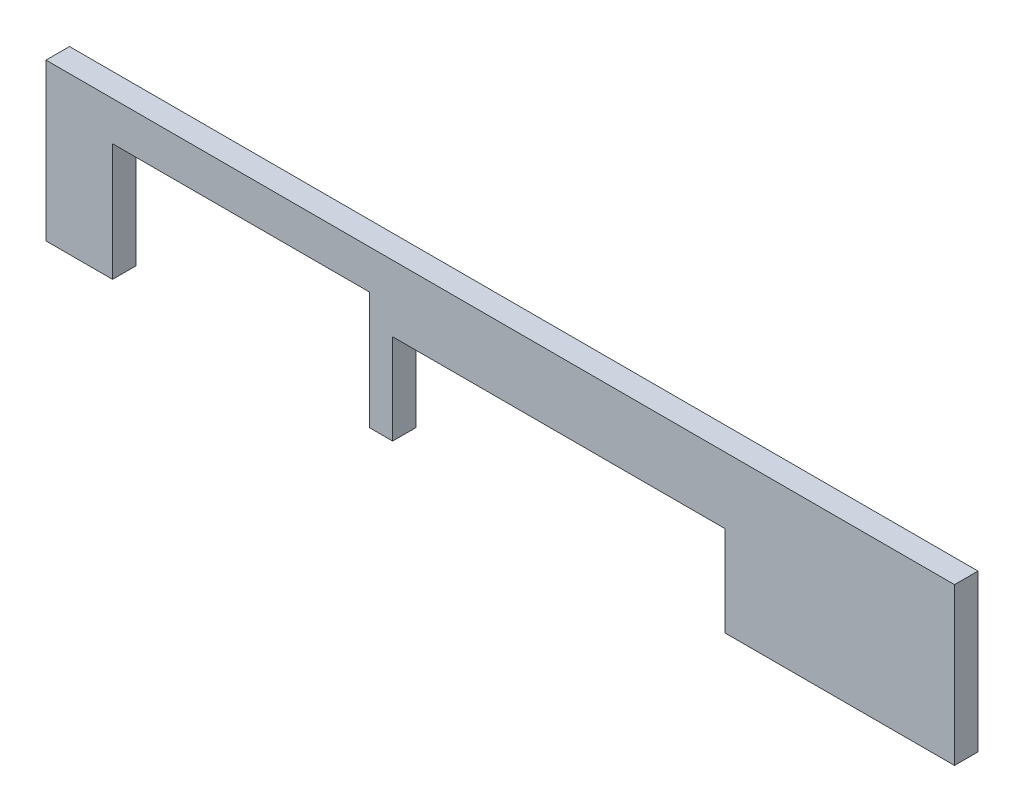
ISO-10303-21;
HEADER;
FILE_DESCRIPTION(('STEP AP214'),'2;1');
FILE_NAME('part.step','',(''),(''),'','','');
FILE_SCHEMA(('AUTOMOTIVE_DESIGN { 1 0 10303 214 1 1 1 1 }'));
ENDSEC;
DATA;
#1=APPLICATION_CONTEXT('core data for automotive mechanical design processes');
#2=APPLICATION_PROTOCOL_DEFINITION('international standard','automotive_design',2000,#1);
#3=PRODUCT_CONTEXT('',#1,'mechanical');
#4=PRODUCT('Part','Part','',(#3));
#5=PRODUCT_RELATED_PRODUCT_CATEGORY('part','',(#4));
#6=PRODUCT_DEFINITION_FORMATION('','',#4);
#7=PRODUCT_DEFINITION_CONTEXT('part definition',#1,'design');
#8=PRODUCT_DEFINITION('design','',#6,#7);
#9=PRODUCT_DEFINITION_SHAPE('','',#8);
#10=(LENGTH_UNIT() NAMED_UNIT(*) SI_UNIT(.MILLI.,.METRE.));
#11=(NAMED_UNIT(*) PLANE_ANGLE_UNIT() SI_UNIT($,.RADIAN.));
#12=(NAMED_UNIT(*) SI_UNIT($,.STERADIAN.) SOLID_ANGLE_UNIT());
#13=UNCERTAINTY_MEASURE_WITH_UNIT(LENGTH_MEASURE(1.E-05),#10,'distance_accuracy_value','');
#14=(GEOMETRIC_REPRESENTATION_CONTEXT(3) GLOBAL_UNCERTAINTY_ASSIGNED_CONTEXT((#13)) GLOBAL_UNIT_ASSIGNED_CONTEXT((#10,
#11,#12)) REPRESENTATION_CONTEXT('',''));
#15=CARTESIAN_POINT('',(0.,0.,0.));
#16=DIRECTION('',(0.,0.,1.));
#17=DIRECTION('',(1.,0.,0.));
#18=AXIS2_PLACEMENT_3D('',#15,#16,#17);
#19=CARTESIAN_POINT('',(0.,0.,3.));
#20=DIRECTION('',(1.,0.,0.));
#21=DIRECTION('',(0.,0.,-1.));
#22=AXIS2_PLACEMENT_3D('',#19,#20,#21);
#23=PLANE('',#22);
#24=DIRECTION('',(0.,-1.,0.));
#25=VECTOR('',#24,1.);
#26=CARTESIAN_POINT('',(0.,0.,0.));
#27=LINE('',#26,#25);
#28=CARTESIAN_POINT('',(0.,20.,0.));
#29=VERTEX_POINT('',#28);
#30=CARTESIAN_POINT('',(0.,0.,0.));
#31=VERTEX_POINT('',#30);
#32=EDGE_CURVE('E155',#29,#31,#27,.T.);
#33=ORIENTED_EDGE('',*,*,#32,.T.);
#34=DIRECTION('',(0.,0.,-1.));
#35=VECTOR('',#34,1.);
#36=CARTESIAN_POINT('',(0.,0.,3.));
#37=LINE('',#36,#35);
#38=CARTESIAN_POINT('',(0.,0.,3.));
#39=VERTEX_POINT('',#38);
#40=EDGE_CURVE('E11',#39,#31,#37,.T.);
#41=ORIENTED_EDGE('',*,*,#40,.F.);
#42=DIRECTION('',(0.,-1.,0.));
#43=VECTOR('',#42,1.);
#44=CARTESIAN_POINT('',(0.,0.,3.));
#45=LINE('',#44,#43);
#46=CARTESIAN_POINT('',(0.,20.,3.));
#47=VERTEX_POINT('',#46);
#48=EDGE_CURVE('E177',#47,#39,#45,.T.);
#49=ORIENTED_EDGE('',*,*,#48,.F.);
#50=DIRECTION('',(0.,0.,-1.));
#51=VECTOR('',#50,1.);
#52=CARTESIAN_POINT('',(0.,20.,3.));
#53=LINE('',#52,#51);
#54=EDGE_CURVE('E151',#47,#29,#53,.T.);
#55=ORIENTED_EDGE('',*,*,#54,.T.);
#56=EDGE_LOOP('',(#33,#41,#49,#55));
#57=FACE_BOUND('',#56,.T.);
#58=ADVANCED_FACE('F35',(#57),#23,.F.);
#59=CARTESIAN_POINT('',(0.,0.,3.));
#60=DIRECTION('',(0.,1.,0.));
#61=DIRECTION('',(0.,0.,1.));
#62=AXIS2_PLACEMENT_3D('',#59,#60,#61);
#63=PLANE('',#62);
#64=DIRECTION('',(1.,0.,0.));
#65=VECTOR('',#64,1.);
#66=CARTESIAN_POINT('',(0.,0.,0.));
#67=LINE('',#66,#65);
#68=CARTESIAN_POINT('',(8.5,0.,0.));
#69=VERTEX_POINT('',#68);
#70=EDGE_CURVE('E158',#31,#69,#67,.T.);
#71=ORIENTED_EDGE('',*,*,#70,.T.);
#72=DIRECTION('',(0.,0.,-1.));
#73=VECTOR('',#72,1.);
#74=CARTESIAN_POINT('',(8.5,0.,3.));
#75=LINE('',#74,#73);
#76=CARTESIAN_POINT('',(8.5,0.,3.));
#77=VERTEX_POINT('',#76);
#78=EDGE_CURVE('E43',#77,#69,#75,.T.);
#79=ORIENTED_EDGE('',*,*,#78,.F.);
#80=DIRECTION('',(1.,0.,0.));
#81=VECTOR('',#80,1.);
#82=CARTESIAN_POINT('',(0.,0.,3.));
#83=LINE('',#82,#81);
#84=EDGE_CURVE('E106',#39,#77,#83,.T.);
#85=ORIENTED_EDGE('',*,*,#84,.F.);
#86=ORIENTED_EDGE('',*,*,#40,.T.);
#87=EDGE_LOOP('',(#71,#79,#85,#86));
#88=FACE_BOUND('',#87,.T.);
#89=ADVANCED_FACE('F255',(#88),#63,.F.);
#90=CARTESIAN_POINT('',(8.5,0.,3.));
#91=DIRECTION('',(-1.,0.,0.));
#92=DIRECTION('',(0.,0.,1.));
#93=AXIS2_PLACEMENT_3D('',#90,#91,#92);
#94=PLANE('',#93);
#95=DIRECTION('',(0.,1.,0.));
#96=VECTOR('',#95,1.);
#97=CARTESIAN_POINT('',(8.5,0.,0.));
#98=LINE('',#97,#96);
#99=CARTESIAN_POINT('',(8.5,15.,0.));
#100=VERTEX_POINT('',#99);
#101=EDGE_CURVE('E160',#69,#100,#98,.T.);
#102=ORIENTED_EDGE('',*,*,#101,.T.);
#103=DIRECTION('',(0.,0.,-1.));
#104=VECTOR('',#103,1.);
#105=CARTESIAN_POINT('',(8.5,15.,3.));
#106=LINE('',#105,#104);
#107=CARTESIAN_POINT('',(8.5,15.,3.));
#108=VERTEX_POINT('',#107);
#109=EDGE_CURVE('E196',#108,#100,#106,.T.);
#110=ORIENTED_EDGE('',*,*,#109,.F.);
#111=DIRECTION('',(0.,1.,0.));
#112=VECTOR('',#111,1.);
#113=CARTESIAN_POINT('',(8.5,0.,3.));
#114=LINE('',#113,#112);
#115=EDGE_CURVE('E204',#77,#108,#114,.T.);
#116=ORIENTED_EDGE('',*,*,#115,.F.);
#117=ORIENTED_EDGE('',*,*,#78,.T.);
#118=EDGE_LOOP('',(#102,#110,#116,#117));
#119=FACE_BOUND('',#118,.T.);
#120=ADVANCED_FACE('F202',(#119),#94,.F.);
#121=CARTESIAN_POINT('',(8.5,15.,3.));
#122=DIRECTION('',(0.,1.,0.));
#123=DIRECTION('',(0.,0.,1.));
#124=AXIS2_PLACEMENT_3D('',#121,#122,#123);
#125=PLANE('',#124);
#126=DIRECTION('',(1.,0.,0.));
#127=VECTOR('',#126,1.);
#128=CARTESIAN_POINT('',(8.5,15.,0.));
#129=LINE('',#128,#127);
#130=CARTESIAN_POINT('',(41.3362446987406,15.,0.));
#131=VERTEX_POINT('',#130);
#132=EDGE_CURVE('E162',#100,#131,#129,.T.);
#133=ORIENTED_EDGE('',*,*,#132,.T.);
#134=DIRECTION('',(0.,0.,-1.));
#135=VECTOR('',#134,1.);
#136=CARTESIAN_POINT('',(41.3362446987406,15.,3.));
#137=LINE('',#136,#135);
#138=CARTESIAN_POINT('',(41.3362446987406,15.,3.));
#139=VERTEX_POINT('',#138);
#140=EDGE_CURVE('E193',#139,#131,#137,.T.);
#141=ORIENTED_EDGE('',*,*,#140,.F.);
#142=DIRECTION('',(1.,0.,0.));
#143=VECTOR('',#142,1.);
#144=CARTESIAN_POINT('',(8.5,15.,3.));
#145=LINE('',#144,#143);
#146=EDGE_CURVE('E222',#108,#139,#145,.T.);
#147=ORIENTED_EDGE('',*,*,#146,.F.);
#148=ORIENTED_EDGE('',*,*,#109,.T.);
#149=EDGE_LOOP('',(#133,#141,#147,#148));
#150=FACE_BOUND('',#149,.T.);
#151=ADVANCED_FACE('F213',(#150),#125,.F.);
#152=CARTESIAN_POINT('',(41.3362446987406,15.,3.));
#153=DIRECTION('',(1.,0.,0.));
#154=DIRECTION('',(0.,0.,-1.));
#155=AXIS2_PLACEMENT_3D('',#152,#153,#154);
#156=PLANE('',#155);
#157=DIRECTION('',(0.,-1.,0.));
#158=VECTOR('',#157,1.);
#159=CARTESIAN_POINT('',(41.3362446987406,15.,0.));
#160=LINE('',#159,#158);
#161=CARTESIAN_POINT('',(41.3362446987406,0.,0.));
#162=VERTEX_POINT('',#161);
#163=EDGE_CURVE('E164',#131,#162,#160,.T.);
#164=ORIENTED_EDGE('',*,*,#163,.T.);
#165=DIRECTION('',(0.,0.,-1.));
#166=VECTOR('',#165,1.);
#167=CARTESIAN_POINT('',(41.3362446987406,0.,3.));
#168=LINE('',#167,#166);
#169=CARTESIAN_POINT('',(41.3362446987406,0.,3.));
#170=VERTEX_POINT('',#169);
#171=EDGE_CURVE('E190',#170,#162,#168,.T.);
#172=ORIENTED_EDGE('',*,*,#171,.F.);
#173=DIRECTION('',(0.,-1.,0.));
#174=VECTOR('',#173,1.);
#175=CARTESIAN_POINT('',(41.3362446987406,15.,3.));
#176=LINE('',#175,#174);
#177=EDGE_CURVE('E219',#139,#170,#176,.T.);
#178=ORIENTED_EDGE('',*,*,#177,.F.);
#179=ORIENTED_EDGE('',*,*,#140,.T.);
#180=EDGE_LOOP('',(#164,#172,#178,#179));
#181=FACE_BOUND('',#180,.T.);
#182=ADVANCED_FACE('F217',(#181),#156,.F.);
#183=CARTESIAN_POINT('',(41.3362446987406,0.,3.));
#184=DIRECTION('',(0.,1.,0.));
#185=DIRECTION('',(0.,0.,1.));
#186=AXIS2_PLACEMENT_3D('',#183,#184,#185);
#187=PLANE('',#186);
#188=DIRECTION('',(1.,0.,0.));
#189=VECTOR('',#188,1.);
#190=CARTESIAN_POINT('',(41.3362446987406,0.,0.));
#191=LINE('',#190,#189);
#192=CARTESIAN_POINT('',(44.2588597671119,0.,0.));
#193=VERTEX_POINT('',#192);
#194=EDGE_CURVE('E166',#162,#193,#191,.T.);
#195=ORIENTED_EDGE('',*,*,#194,.T.);
#196=DIRECTION('',(0.,0.,-1.));
#197=VECTOR('',#196,1.);
#198=CARTESIAN_POINT('',(44.2588597671119,0.,3.));
#199=LINE('',#198,#197);
#200=CARTESIAN_POINT('',(44.2588597671119,0.,3.));
#201=VERTEX_POINT('',#200);
#202=EDGE_CURVE('E187',#201,#193,#199,.T.);
#203=ORIENTED_EDGE('',*,*,#202,.F.);
#204=DIRECTION('',(1.,0.,0.));
#205=VECTOR('',#204,1.);
#206=CARTESIAN_POINT('',(41.3362446987406,0.,3.));
#207=LINE('',#206,#205);
#208=EDGE_CURVE('E221',#170,#201,#207,.T.);
#209=ORIENTED_EDGE('',*,*,#208,.F.);
#210=ORIENTED_EDGE('',*,*,#171,.T.);
#211=EDGE_LOOP('',(#195,#203,#209,#210));
#212=FACE_BOUND('',#211,.T.);
#213=ADVANCED_FACE('F268',(#212),#187,.F.);
#214=CARTESIAN_POINT('',(44.2588597671119,0.,3.));
#215=DIRECTION('',(-1.,0.,0.));
#216=DIRECTION('',(0.,0.,1.));
#217=AXIS2_PLACEMENT_3D('',#214,#215,#216);
#218=PLANE('',#217);
#219=DIRECTION('',(0.,1.,0.));
#220=VECTOR('',#219,1.);
#221=CARTESIAN_POINT('',(44.2588597671119,0.,0.));
#222=LINE('',#221,#220);
#223=CARTESIAN_POINT('',(44.2588597671119,11.5366263755732,0.));
#224=VERTEX_POINT('',#223);
#225=EDGE_CURVE('E168',#193,#224,#222,.T.);
#226=ORIENTED_EDGE('',*,*,#225,.T.);
#227=DIRECTION('',(0.,0.,-1.));
#228=VECTOR('',#227,1.);
#229=CARTESIAN_POINT('',(44.2588597671119,11.5366263755732,3.));
#230=LINE('',#229,#228);
#231=CARTESIAN_POINT('',(44.2588597671119,11.5366263755732,3.));
#232=VERTEX_POINT('',#231);
#233=EDGE_CURVE('E184',#232,#224,#230,.T.);
#234=ORIENTED_EDGE('',*,*,#233,.F.);
#235=DIRECTION('',(0.,1.,0.));
#236=VECTOR('',#235,1.);
#237=CARTESIAN_POINT('',(44.2588597671119,0.,3.));
#238=LINE('',#237,#236);
#239=EDGE_CURVE('E224',#201,#232,#238,.T.);
#240=ORIENTED_EDGE('',*,*,#239,.F.);
#241=ORIENTED_EDGE('',*,*,#202,.T.);
#242=EDGE_LOOP('',(#226,#234,#240,#241));
#243=FACE_BOUND('',#242,.T.);
#244=ADVANCED_FACE('F271',(#243),#218,.F.);
#245=CARTESIAN_POINT('',(44.2588597671119,11.5366263755732,3.));
#246=DIRECTION('',(0.,1.,0.));
#247=DIRECTION('',(0.,0.,1.));
#248=AXIS2_PLACEMENT_3D('',#245,#246,#247);
#249=PLANE('',#248);
#250=DIRECTION('',(1.,0.,0.));
#251=VECTOR('',#250,1.);
#252=CARTESIAN_POINT('',(44.2588597671119,11.5366263755732,0.));
#253=LINE('',#252,#251);
#254=CARTESIAN_POINT('',(86.6740253791649,11.5366263755732,0.));
#255=VERTEX_POINT('',#254);
#256=EDGE_CURVE('E170',#224,#255,#253,.T.);
#257=ORIENTED_EDGE('',*,*,#256,.T.);
#258=DIRECTION('',(0.,0.,-1.));
#259=VECTOR('',#258,1.);
#260=CARTESIAN_POINT('',(86.6740253791649,11.5366263755732,3.));
#261=LINE('',#260,#259);
#262=CARTESIAN_POINT('',(86.6740253791649,11.5366263755732,3.));
#263=VERTEX_POINT('',#262);
#264=EDGE_CURVE('E181',#263,#255,#261,.T.);
#265=ORIENTED_EDGE('',*,*,#264,.F.);
#266=DIRECTION('',(1.,0.,0.));
#267=VECTOR('',#266,1.);
#268=CARTESIAN_POINT('',(44.2588597671119,11.5366263755732,3.));
#269=LINE('',#268,#267);
#270=EDGE_CURVE('E230',#232,#263,#269,.T.);
#271=ORIENTED_EDGE('',*,*,#270,.F.);
#272=ORIENTED_EDGE('',*,*,#233,.T.);
#273=EDGE_LOOP('',(#257,#265,#271,#272));
#274=FACE_BOUND('',#273,.T.);
#275=ADVANCED_FACE('F236',(#274),#249,.F.);
#276=CARTESIAN_POINT('',(86.6740253791649,11.5366263755732,3.));
#277=DIRECTION('',(1.,0.,0.));
#278=DIRECTION('',(0.,0.,-1.));
#279=AXIS2_PLACEMENT_3D('',#276,#277,#278);
#280=PLANE('',#279);
#281=DIRECTION('',(0.,-1.,0.));
#282=VECTOR('',#281,1.);
#283=CARTESIAN_POINT('',(86.6740253791649,11.5366263755732,0.));
#284=LINE('',#283,#282);
#285=CARTESIAN_POINT('',(86.6740253791649,0.,0.));
#286=VERTEX_POINT('',#285);
#287=EDGE_CURVE('E172',#255,#286,#284,.T.);
#288=ORIENTED_EDGE('',*,*,#287,.T.);
#289=DIRECTION('',(0.,0.,-1.));
#290=VECTOR('',#289,1.);
#291=CARTESIAN_POINT('',(86.6740253791649,0.,3.));
#292=LINE('',#291,#290);
#293=CARTESIAN_POINT('',(86.6740253791649,0.,3.));
#294=VERTEX_POINT('',#293);
#295=EDGE_CURVE('E146',#294,#286,#292,.T.);
#296=ORIENTED_EDGE('',*,*,#295,.F.);
#297=DIRECTION('',(0.,-1.,0.));
#298=VECTOR('',#297,1.);
#299=CARTESIAN_POINT('',(86.6740253791649,11.5366263755732,3.));
#300=LINE('',#299,#298);
#301=EDGE_CURVE('E137',#263,#294,#300,.T.);
#302=ORIENTED_EDGE('',*,*,#301,.F.);
#303=ORIENTED_EDGE('',*,*,#264,.T.);
#304=EDGE_LOOP('',(#288,#296,#302,#303));
#305=FACE_BOUND('',#304,.T.);
#306=ADVANCED_FACE('F240',(#305),#280,.F.);
#307=CARTESIAN_POINT('',(86.6740253791649,0.,3.));
#308=DIRECTION('',(0.,1.,0.));
#309=DIRECTION('',(0.,0.,1.));
#310=AXIS2_PLACEMENT_3D('',#307,#308,#309);
#311=PLANE('',#310);
#312=DIRECTION('',(1.,0.,0.));
#313=VECTOR('',#312,1.);
#314=CARTESIAN_POINT('',(86.6740253791649,0.,0.));
#315=LINE('',#314,#313);
#316=CARTESIAN_POINT('',(116.,0.,0.));
#317=VERTEX_POINT('',#316);
#318=EDGE_CURVE('E145',#286,#317,#315,.T.);
#319=ORIENTED_EDGE('',*,*,#318,.T.);
#320=DIRECTION('',(0.,0.,-1.));
#321=VECTOR('',#320,1.);
#322=CARTESIAN_POINT('',(116.,0.,3.));
#323=LINE('',#322,#321);
#324=CARTESIAN_POINT('',(116.,0.,3.));
#325=VERTEX_POINT('',#324);
#326=EDGE_CURVE('E142',#325,#317,#323,.T.);
#327=ORIENTED_EDGE('',*,*,#326,.F.);
#328=DIRECTION('',(1.,0.,0.));
#329=VECTOR('',#328,1.);
#330=CARTESIAN_POINT('',(86.6740253791649,0.,3.));
#331=LINE('',#330,#329);
#332=EDGE_CURVE('E131',#294,#325,#331,.T.);
#333=ORIENTED_EDGE('',*,*,#332,.F.);
#334=ORIENTED_EDGE('',*,*,#295,.T.);
#335=EDGE_LOOP('',(#319,#327,#333,#334));
#336=FACE_BOUND('',#335,.T.);
#337=ADVANCED_FACE('F143',(#336),#311,.F.);
#338=CARTESIAN_POINT('',(116.,0.,3.));
#339=DIRECTION('',(-1.,0.,0.));
#340=DIRECTION('',(0.,0.,1.));
#341=AXIS2_PLACEMENT_3D('',#338,#339,#340);
#342=PLANE('',#341);
#343=DIRECTION('',(0.,1.,0.));
#344=VECTOR('',#343,1.);
#345=CARTESIAN_POINT('',(116.,0.,0.));
#346=LINE('',#345,#344);
#347=CARTESIAN_POINT('',(116.,20.,0.));
#348=VERTEX_POINT('',#347);
#349=EDGE_CURVE('E92',#317,#348,#346,.T.);
#350=ORIENTED_EDGE('',*,*,#349,.T.);
#351=DIRECTION('',(0.,0.,-1.));
#352=VECTOR('',#351,1.);
#353=CARTESIAN_POINT('',(116.,20.,3.));
#354=LINE('',#353,#352);
#355=CARTESIAN_POINT('',(116.,20.,3.));
#356=VERTEX_POINT('',#355);
#357=EDGE_CURVE('E147',#356,#348,#354,.T.);
#358=ORIENTED_EDGE('',*,*,#357,.F.);
#359=DIRECTION('',(0.,1.,0.));
#360=VECTOR('',#359,1.);
#361=CARTESIAN_POINT('',(116.,0.,3.));
#362=LINE('',#361,#360);
#363=EDGE_CURVE('E135',#325,#356,#362,.T.);
#364=ORIENTED_EDGE('',*,*,#363,.F.);
#365=ORIENTED_EDGE('',*,*,#326,.T.);
#366=EDGE_LOOP('',(#350,#358,#364,#365));
#367=FACE_BOUND('',#366,.T.);
#368=ADVANCED_FACE('F149',(#367),#342,.F.);
#369=CARTESIAN_POINT('',(0.,20.,3.));
#370=DIRECTION('',(0.,-1.,0.));
#371=DIRECTION('',(0.,0.,-1.));
#372=AXIS2_PLACEMENT_3D('',#369,#370,#371);
#373=PLANE('',#372);
#374=DIRECTION('',(-1.,0.,0.));
#375=VECTOR('',#374,1.);
#376=CARTESIAN_POINT('',(0.,20.,0.));
#377=LINE('',#376,#375);
#378=EDGE_CURVE('E98',#348,#29,#377,.T.);
#379=ORIENTED_EDGE('',*,*,#378,.T.);
#380=ORIENTED_EDGE('',*,*,#54,.F.);
#381=DIRECTION('',(-1.,0.,0.));
#382=VECTOR('',#381,1.);
#383=CARTESIAN_POINT('',(0.,20.,3.));
#384=LINE('',#383,#382);
#385=EDGE_CURVE('E51',#356,#47,#384,.T.);
#386=ORIENTED_EDGE('',*,*,#385,.F.);
#387=ORIENTED_EDGE('',*,*,#357,.T.);
#388=EDGE_LOOP('',(#379,#380,#386,#387));
#389=FACE_BOUND('',#388,.T.);
#390=ADVANCED_FACE('F244',(#389),#373,.F.);
#391=CARTESIAN_POINT('',(0.,0.,3.));
#392=DIRECTION('',(0.,0.,-1.));
#393=DIRECTION('',(-1.,0.,0.));
#394=AXIS2_PLACEMENT_3D('',#391,#392,#393);
#395=PLANE('',#394);
#396=ORIENTED_EDGE('',*,*,#48,.T.);
#397=ORIENTED_EDGE('',*,*,#84,.T.);
#398=ORIENTED_EDGE('',*,*,#115,.T.);
#399=ORIENTED_EDGE('',*,*,#146,.T.);
#400=ORIENTED_EDGE('',*,*,#177,.T.);
#401=ORIENTED_EDGE('',*,*,#208,.T.);
#402=ORIENTED_EDGE('',*,*,#239,.T.);
#403=ORIENTED_EDGE('',*,*,#270,.T.);
#404=ORIENTED_EDGE('',*,*,#301,.T.);
#405=ORIENTED_EDGE('',*,*,#332,.T.);
#406=ORIENTED_EDGE('',*,*,#363,.T.);
#407=ORIENTED_EDGE('',*,*,#385,.T.);
#408=EDGE_LOOP('',(#396,#397,#398,#399,#400,#401,#402,#403,#404,#405,#406,#407));
#409=FACE_BOUND('',#408,.T.);
#410=ADVANCED_FACE('F133',(#409),#395,.F.);
#411=CARTESIAN_POINT('',(0.,0.,0.));
#412=DIRECTION('',(0.,0.,-1.));
#413=DIRECTION('',(-1.,0.,0.));
#414=AXIS2_PLACEMENT_3D('',#411,#412,#413);
#415=PLANE('',#414);
#416=ORIENTED_EDGE('',*,*,#32,.F.);
#417=ORIENTED_EDGE('',*,*,#378,.F.);
#418=ORIENTED_EDGE('',*,*,#349,.F.);
#419=ORIENTED_EDGE('',*,*,#318,.F.);
#420=ORIENTED_EDGE('',*,*,#287,.F.);
#421=ORIENTED_EDGE('',*,*,#256,.F.);
#422=ORIENTED_EDGE('',*,*,#225,.F.);
#423=ORIENTED_EDGE('',*,*,#194,.F.);
#424=ORIENTED_EDGE('',*,*,#163,.F.);
#425=ORIENTED_EDGE('',*,*,#132,.F.);
#426=ORIENTED_EDGE('',*,*,#101,.F.);
#427=ORIENTED_EDGE('',*,*,#70,.F.);
#428=EDGE_LOOP('',(#416,#417,#418,#419,#420,#421,#422,#423,#424,#425,#426,#427));
#429=FACE_BOUND('',#428,.T.);
#430=ADVANCED_FACE('F208',(#429),#415,.T.);
#431=CLOSED_SHELL('',(#58,#89,#120,#151,#182,#213,#244,#275,#306,#337,#368,#390,#410,#430));
#432=MANIFOLD_SOLID_BREP('B2',#431);
#433=ADVANCED_BREP_SHAPE_REPRESENTATION('',(#18,#432),#14);
#434=SHAPE_DEFINITION_REPRESENTATION(#9,#433);
ENDSEC;
END-ISO-10303-21;
